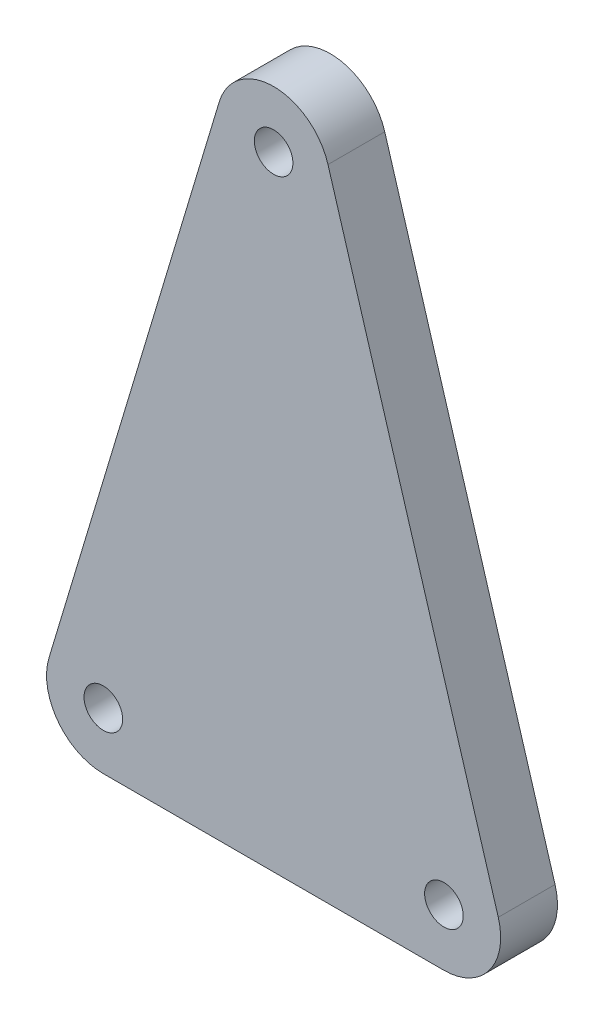
ISO-10303-21;
HEADER;
FILE_DESCRIPTION(('STEP AP214'),'2;1');
FILE_NAME('part.step','',(''),(''),'','','');
FILE_SCHEMA(('AUTOMOTIVE_DESIGN { 1 0 10303 214 1 1 1 1 }'));
ENDSEC;
DATA;
#1=APPLICATION_CONTEXT('core data for automotive mechanical design processes');
#2=APPLICATION_PROTOCOL_DEFINITION('international standard','automotive_design',2000,#1);
#3=PRODUCT_CONTEXT('',#1,'mechanical');
#4=PRODUCT('Part','Part','',(#3));
#5=PRODUCT_RELATED_PRODUCT_CATEGORY('part','',(#4));
#6=PRODUCT_DEFINITION_FORMATION('','',#4);
#7=PRODUCT_DEFINITION_CONTEXT('part definition',#1,'design');
#8=PRODUCT_DEFINITION('design','',#6,#7);
#9=PRODUCT_DEFINITION_SHAPE('','',#8);
#10=(LENGTH_UNIT() NAMED_UNIT(*) SI_UNIT(.MILLI.,.METRE.));
#11=(NAMED_UNIT(*) PLANE_ANGLE_UNIT() SI_UNIT($,.RADIAN.));
#12=(NAMED_UNIT(*) SI_UNIT($,.STERADIAN.) SOLID_ANGLE_UNIT());
#13=UNCERTAINTY_MEASURE_WITH_UNIT(LENGTH_MEASURE(1.E-05),#10,'distance_accuracy_value','');
#14=(GEOMETRIC_REPRESENTATION_CONTEXT(3) GLOBAL_UNCERTAINTY_ASSIGNED_CONTEXT((#13)) GLOBAL_UNIT_ASSIGNED_CONTEXT((#10,
#11,#12)) REPRESENTATION_CONTEXT('',''));
#15=CARTESIAN_POINT('',(0.,0.,0.));
#16=DIRECTION('',(0.,0.,1.));
#17=DIRECTION('',(1.,0.,0.));
#18=AXIS2_PLACEMENT_3D('',#15,#16,#17);
#19=CARTESIAN_POINT('',(0.,49.92,5.));
#20=DIRECTION('',(0.,0.,-1.));
#21=DIRECTION('',(-1.,0.,0.));
#22=AXIS2_PLACEMENT_3D('',#19,#20,#21);
#23=CYLINDRICAL_SURFACE('',#22,5.);
#24=CARTESIAN_POINT('',(0.,49.92,0.));
#25=DIRECTION('',(0.,0.,1.));
#26=DIRECTION('',(1.,0.,0.));
#27=AXIS2_PLACEMENT_3D('',#24,#25,#26);
#28=CIRCLE('',#27,5.);
#29=CARTESIAN_POINT('',(4.78849733775923,51.3588513635094,0.));
#30=VERTEX_POINT('',#29);
#31=CARTESIAN_POINT('',(-4.78849733775923,51.3588513635094,0.));
#32=VERTEX_POINT('',#31);
#33=EDGE_CURVE('E116',#30,#32,#28,.T.);
#34=ORIENTED_EDGE('',*,*,#33,.T.);
#35=DIRECTION('',(0.,0.,-1.));
#36=VECTOR('',#35,1.);
#37=CARTESIAN_POINT('',(-4.78849733775923,51.3588513635094,5.));
#38=LINE('',#37,#36);
#39=CARTESIAN_POINT('',(-4.78849733775923,51.3588513635094,5.));
#40=VERTEX_POINT('',#39);
#41=EDGE_CURVE('E11',#40,#32,#38,.T.);
#42=ORIENTED_EDGE('',*,*,#41,.F.);
#43=CARTESIAN_POINT('',(0.,49.92,5.));
#44=DIRECTION('',(0.,0.,1.));
#45=DIRECTION('',(1.,0.,0.));
#46=AXIS2_PLACEMENT_3D('',#43,#44,#45);
#47=CIRCLE('',#46,5.);
#48=CARTESIAN_POINT('',(4.78849733775923,51.3588513635094,5.));
#49=VERTEX_POINT('',#48);
#50=EDGE_CURVE('E127',#49,#40,#47,.T.);
#51=ORIENTED_EDGE('',*,*,#50,.F.);
#52=DIRECTION('',(0.,0.,-1.));
#53=VECTOR('',#52,1.);
#54=CARTESIAN_POINT('',(4.78849733775923,51.3588513635094,5.));
#55=LINE('',#54,#53);
#56=EDGE_CURVE('E112',#49,#30,#55,.T.);
#57=ORIENTED_EDGE('',*,*,#56,.T.);
#58=EDGE_LOOP('',(#34,#42,#51,#57));
#59=FACE_BOUND('',#58,.T.);
#60=ADVANCED_FACE('F32',(#59),#23,.T.);
#61=CARTESIAN_POINT('',(-4.78849733775923,51.3588513635094,5.));
#62=DIRECTION('',(0.957699467551845,-0.287770272701877,0.));
#63=DIRECTION('',(0.287770272701877,0.957699467551845,0.));
#64=AXIS2_PLACEMENT_3D('',#61,#62,#63);
#65=PLANE('',#64);
#66=DIRECTION('',(-0.287770272701877,-0.957699467551845,0.));
#67=VECTOR('',#66,1.);
#68=CARTESIAN_POINT('',(-4.78849733775923,51.3588513635094,0.));
#69=LINE('',#68,#67);
#70=CARTESIAN_POINT('',(-19.7884973377592,1.43885136350939,0.));
#71=VERTEX_POINT('',#70);
#72=EDGE_CURVE('E119',#32,#71,#69,.T.);
#73=ORIENTED_EDGE('',*,*,#72,.T.);
#74=DIRECTION('',(0.,0.,-1.));
#75=VECTOR('',#74,1.);
#76=CARTESIAN_POINT('',(-19.7884973377592,1.43885136350939,5.));
#77=LINE('',#76,#75);
#78=CARTESIAN_POINT('',(-19.7884973377592,1.43885136350939,5.));
#79=VERTEX_POINT('',#78);
#80=EDGE_CURVE('E40',#79,#71,#77,.T.);
#81=ORIENTED_EDGE('',*,*,#80,.F.);
#82=DIRECTION('',(-0.287770272701877,-0.957699467551845,0.));
#83=VECTOR('',#82,1.);
#84=CARTESIAN_POINT('',(-4.78849733775923,51.3588513635094,5.));
#85=LINE('',#84,#83);
#86=EDGE_CURVE('E85',#40,#79,#85,.T.);
#87=ORIENTED_EDGE('',*,*,#86,.F.);
#88=ORIENTED_EDGE('',*,*,#41,.T.);
#89=EDGE_LOOP('',(#73,#81,#87,#88));
#90=FACE_BOUND('',#89,.T.);
#91=ADVANCED_FACE('F152',(#90),#65,.F.);
#92=CARTESIAN_POINT('',(-15.,0.,5.));
#93=DIRECTION('',(0.,0.,-1.));
#94=DIRECTION('',(-1.,0.,0.));
#95=AXIS2_PLACEMENT_3D('',#92,#93,#94);
#96=CYLINDRICAL_SURFACE('',#95,5.);
#97=CARTESIAN_POINT('',(-15.,0.,0.));
#98=DIRECTION('',(0.,0.,1.));
#99=DIRECTION('',(-1.,0.,0.));
#100=AXIS2_PLACEMENT_3D('',#97,#98,#99);
#101=CIRCLE('',#100,5.);
#102=CARTESIAN_POINT('',(-15.,-5.,0.));
#103=VERTEX_POINT('',#102);
#104=EDGE_CURVE('E122',#71,#103,#101,.T.);
#105=ORIENTED_EDGE('',*,*,#104,.T.);
#106=DIRECTION('',(0.,0.,-1.));
#107=VECTOR('',#106,1.);
#108=CARTESIAN_POINT('',(-15.,-5.,5.));
#109=LINE('',#108,#107);
#110=CARTESIAN_POINT('',(-15.,-5.,5.));
#111=VERTEX_POINT('',#110);
#112=EDGE_CURVE('E107',#111,#103,#109,.T.);
#113=ORIENTED_EDGE('',*,*,#112,.F.);
#114=CARTESIAN_POINT('',(-15.,0.,5.));
#115=DIRECTION('',(0.,0.,1.));
#116=DIRECTION('',(-1.,0.,0.));
#117=AXIS2_PLACEMENT_3D('',#114,#115,#116);
#118=CIRCLE('',#117,5.);
#119=EDGE_CURVE('E98',#79,#111,#118,.T.);
#120=ORIENTED_EDGE('',*,*,#119,.F.);
#121=ORIENTED_EDGE('',*,*,#80,.T.);
#122=EDGE_LOOP('',(#105,#113,#120,#121));
#123=FACE_BOUND('',#122,.T.);
#124=ADVANCED_FACE('F133',(#123),#96,.T.);
#125=CARTESIAN_POINT('',(15.,-5.,5.));
#126=DIRECTION('',(0.,1.,0.));
#127=DIRECTION('',(0.,0.,1.));
#128=AXIS2_PLACEMENT_3D('',#125,#126,#127);
#129=PLANE('',#128);
#130=DIRECTION('',(1.,0.,0.));
#131=VECTOR('',#130,1.);
#132=CARTESIAN_POINT('',(15.,-5.,0.));
#133=LINE('',#132,#131);
#134=CARTESIAN_POINT('',(15.,-5.,0.));
#135=VERTEX_POINT('',#134);
#136=EDGE_CURVE('E106',#103,#135,#133,.T.);
#137=ORIENTED_EDGE('',*,*,#136,.T.);
#138=DIRECTION('',(0.,0.,-1.));
#139=VECTOR('',#138,1.);
#140=CARTESIAN_POINT('',(15.,-5.,5.));
#141=LINE('',#140,#139);
#142=CARTESIAN_POINT('',(15.,-5.,5.));
#143=VERTEX_POINT('',#142);
#144=EDGE_CURVE('E103',#143,#135,#141,.T.);
#145=ORIENTED_EDGE('',*,*,#144,.F.);
#146=DIRECTION('',(1.,0.,0.));
#147=VECTOR('',#146,1.);
#148=CARTESIAN_POINT('',(15.,-5.,5.));
#149=LINE('',#148,#147);
#150=EDGE_CURVE('E92',#111,#143,#149,.T.);
#151=ORIENTED_EDGE('',*,*,#150,.F.);
#152=ORIENTED_EDGE('',*,*,#112,.T.);
#153=EDGE_LOOP('',(#137,#145,#151,#152));
#154=FACE_BOUND('',#153,.T.);
#155=ADVANCED_FACE('F104',(#154),#129,.F.);
#156=CARTESIAN_POINT('',(15.,0.,5.));
#157=DIRECTION('',(0.,0.,-1.));
#158=DIRECTION('',(-1.,0.,0.));
#159=AXIS2_PLACEMENT_3D('',#156,#157,#158);
#160=CYLINDRICAL_SURFACE('',#159,5.);
#161=CARTESIAN_POINT('',(15.,0.,0.));
#162=DIRECTION('',(0.,0.,1.));
#163=DIRECTION('',(1.,0.,0.));
#164=AXIS2_PLACEMENT_3D('',#161,#162,#163);
#165=CIRCLE('',#164,5.);
#166=CARTESIAN_POINT('',(19.7884973377592,1.43885136350938,0.));
#167=VERTEX_POINT('',#166);
#168=EDGE_CURVE('E71',#135,#167,#165,.T.);
#169=ORIENTED_EDGE('',*,*,#168,.T.);
#170=DIRECTION('',(0.,0.,-1.));
#171=VECTOR('',#170,1.);
#172=CARTESIAN_POINT('',(19.7884973377592,1.43885136350938,5.));
#173=LINE('',#172,#171);
#174=CARTESIAN_POINT('',(19.7884973377592,1.43885136350938,5.));
#175=VERTEX_POINT('',#174);
#176=EDGE_CURVE('E108',#175,#167,#173,.T.);
#177=ORIENTED_EDGE('',*,*,#176,.F.);
#178=CARTESIAN_POINT('',(15.,0.,5.));
#179=DIRECTION('',(0.,0.,1.));
#180=DIRECTION('',(1.,0.,0.));
#181=AXIS2_PLACEMENT_3D('',#178,#179,#180);
#182=CIRCLE('',#181,5.);
#183=EDGE_CURVE('E96',#143,#175,#182,.T.);
#184=ORIENTED_EDGE('',*,*,#183,.F.);
#185=ORIENTED_EDGE('',*,*,#144,.T.);
#186=EDGE_LOOP('',(#169,#177,#184,#185));
#187=FACE_BOUND('',#186,.T.);
#188=ADVANCED_FACE('F110',(#187),#160,.T.);
#189=CARTESIAN_POINT('',(4.78849733775923,51.3588513635094,5.));
#190=DIRECTION('',(-0.957699467551845,-0.287770272701877,0.));
#191=DIRECTION('',(0.287770272701877,-0.957699467551845,0.));
#192=AXIS2_PLACEMENT_3D('',#189,#190,#191);
#193=PLANE('',#192);
#194=DIRECTION('',(-0.287770272701877,0.957699467551845,0.));
#195=VECTOR('',#194,1.);
#196=CARTESIAN_POINT('',(4.78849733775923,51.3588513635094,0.));
#197=LINE('',#196,#195);
#198=EDGE_CURVE('E77',#167,#30,#197,.T.);
#199=ORIENTED_EDGE('',*,*,#198,.T.);
#200=ORIENTED_EDGE('',*,*,#56,.F.);
#201=DIRECTION('',(-0.287770272701877,0.957699467551845,0.));
#202=VECTOR('',#201,1.);
#203=CARTESIAN_POINT('',(4.78849733775923,51.3588513635094,5.));
#204=LINE('',#203,#202);
#205=EDGE_CURVE('E48',#175,#49,#204,.T.);
#206=ORIENTED_EDGE('',*,*,#205,.F.);
#207=ORIENTED_EDGE('',*,*,#176,.T.);
#208=EDGE_LOOP('',(#199,#200,#206,#207));
#209=FACE_BOUND('',#208,.T.);
#210=ADVANCED_FACE('F140',(#209),#193,.F.);
#211=CARTESIAN_POINT('',(0.,49.92,5.));
#212=DIRECTION('',(0.,0.,1.));
#213=DIRECTION('',(1.,0.,0.));
#214=AXIS2_PLACEMENT_3D('',#211,#212,#213);
#215=PLANE('',#214);
#216=CARTESIAN_POINT('',(0.,49.92,5.));
#217=DIRECTION('',(0.,0.,-1.));
#218=DIRECTION('',(-1.,0.,0.));
#219=AXIS2_PLACEMENT_3D('',#216,#217,#218);
#220=CIRCLE('',#219,1.7);
#221=CARTESIAN_POINT('',(-1.7,49.92,5.));
#222=VERTEX_POINT('',#221);
#223=EDGE_CURVE('E260',#222,#222,#220,.T.);
#224=ORIENTED_EDGE('',*,*,#223,.T.);
#225=EDGE_LOOP('',(#224));
#226=FACE_BOUND('',#225,.T.);
#227=CARTESIAN_POINT('',(15.,0.,5.));
#228=DIRECTION('',(0.,0.,-1.));
#229=DIRECTION('',(-1.,0.,0.));
#230=AXIS2_PLACEMENT_3D('',#227,#228,#229);
#231=CIRCLE('',#230,1.7);
#232=CARTESIAN_POINT('',(13.3,0.,5.));
#233=VERTEX_POINT('',#232);
#234=EDGE_CURVE('E271',#233,#233,#231,.T.);
#235=ORIENTED_EDGE('',*,*,#234,.T.);
#236=EDGE_LOOP('',(#235));
#237=FACE_BOUND('',#236,.T.);
#238=CARTESIAN_POINT('',(-15.,0.,5.));
#239=DIRECTION('',(0.,0.,-1.));
#240=DIRECTION('',(-1.,0.,0.));
#241=AXIS2_PLACEMENT_3D('',#238,#239,#240);
#242=CIRCLE('',#241,1.7);
#243=CARTESIAN_POINT('',(-16.7,0.,5.));
#244=VERTEX_POINT('',#243);
#245=EDGE_CURVE('E120',#244,#244,#242,.T.);
#246=ORIENTED_EDGE('',*,*,#245,.T.);
#247=EDGE_LOOP('',(#246));
#248=FACE_BOUND('',#247,.T.);
#249=ORIENTED_EDGE('',*,*,#50,.T.);
#250=ORIENTED_EDGE('',*,*,#86,.T.);
#251=ORIENTED_EDGE('',*,*,#119,.T.);
#252=ORIENTED_EDGE('',*,*,#150,.T.);
#253=ORIENTED_EDGE('',*,*,#183,.T.);
#254=ORIENTED_EDGE('',*,*,#205,.T.);
#255=EDGE_LOOP('',(#249,#250,#251,#252,#253,#254));
#256=FACE_BOUND('',#255,.T.);
#257=ADVANCED_FACE('F94',(#226,#237,#248,#256),#215,.T.);
#258=CARTESIAN_POINT('',(0.,49.92,0.));
#259=DIRECTION('',(0.,0.,1.));
#260=DIRECTION('',(1.,0.,0.));
#261=AXIS2_PLACEMENT_3D('',#258,#259,#260);
#262=PLANE('',#261);
#263=CARTESIAN_POINT('',(0.,49.92,0.));
#264=DIRECTION('',(0.,0.,-1.));
#265=DIRECTION('',(-1.,0.,0.));
#266=AXIS2_PLACEMENT_3D('',#263,#264,#265);
#267=CIRCLE('',#266,3.15);
#268=CARTESIAN_POINT('',(-3.15,49.92,0.));
#269=VERTEX_POINT('',#268);
#270=EDGE_CURVE('E258',#269,#269,#267,.T.);
#271=ORIENTED_EDGE('',*,*,#270,.F.);
#272=EDGE_LOOP('',(#271));
#273=FACE_BOUND('',#272,.T.);
#274=CARTESIAN_POINT('',(15.,0.,0.));
#275=DIRECTION('',(0.,0.,-1.));
#276=DIRECTION('',(-1.,0.,0.));
#277=AXIS2_PLACEMENT_3D('',#274,#275,#276);
#278=CIRCLE('',#277,3.15);
#279=CARTESIAN_POINT('',(11.85,0.,0.));
#280=VERTEX_POINT('',#279);
#281=EDGE_CURVE('E265',#280,#280,#278,.T.);
#282=ORIENTED_EDGE('',*,*,#281,.F.);
#283=EDGE_LOOP('',(#282));
#284=FACE_BOUND('',#283,.T.);
#285=CARTESIAN_POINT('',(-15.,0.,0.));
#286=DIRECTION('',(0.,0.,-1.));
#287=DIRECTION('',(-1.,0.,0.));
#288=AXIS2_PLACEMENT_3D('',#285,#286,#287);
#289=CIRCLE('',#288,3.15);
#290=CARTESIAN_POINT('',(-18.15,0.,0.));
#291=VERTEX_POINT('',#290);
#292=EDGE_CURVE('E274',#291,#291,#289,.T.);
#293=ORIENTED_EDGE('',*,*,#292,.F.);
#294=EDGE_LOOP('',(#293));
#295=FACE_BOUND('',#294,.T.);
#296=ORIENTED_EDGE('',*,*,#33,.F.);
#297=ORIENTED_EDGE('',*,*,#198,.F.);
#298=ORIENTED_EDGE('',*,*,#168,.F.);
#299=ORIENTED_EDGE('',*,*,#136,.F.);
#300=ORIENTED_EDGE('',*,*,#104,.F.);
#301=ORIENTED_EDGE('',*,*,#72,.F.);
#302=EDGE_LOOP('',(#296,#297,#298,#299,#300,#301));
#303=FACE_BOUND('',#302,.T.);
#304=ADVANCED_FACE('F136',(#273,#284,#295,#303),#262,.F.);
#305=CARTESIAN_POINT('',(-15.,0.,0.));
#306=DIRECTION('',(0.,0.,-1.));
#307=DIRECTION('',(-1.,0.,0.));
#308=AXIS2_PLACEMENT_3D('',#305,#306,#307);
#309=CYLINDRICAL_SURFACE('',#308,1.69999999999999);
#310=ORIENTED_EDGE('',*,*,#245,.F.);
#311=EDGE_LOOP('',(#310));
#312=FACE_BOUND('',#311,.T.);
#313=CARTESIAN_POINT('',(-15.,0.,1.45000000000001));
#314=DIRECTION('',(0.,0.,-1.));
#315=DIRECTION('',(-1.,0.,0.));
#316=AXIS2_PLACEMENT_3D('',#313,#314,#315);
#317=CIRCLE('',#316,1.69999999999999);
#318=CARTESIAN_POINT('',(-16.7,0.,1.45000000000001));
#319=VERTEX_POINT('',#318);
#320=EDGE_CURVE('E277',#319,#319,#317,.T.);
#321=ORIENTED_EDGE('',*,*,#320,.T.);
#322=EDGE_LOOP('',(#321));
#323=FACE_BOUND('',#322,.T.);
#324=ADVANCED_FACE('F189',(#312,#323),#309,.F.);
#325=CARTESIAN_POINT('',(-15.,0.,0.));
#326=DIRECTION('',(0.,0.,-1.));
#327=DIRECTION('',(-1.,0.,0.));
#328=AXIS2_PLACEMENT_3D('',#325,#326,#327);
#329=CONICAL_SURFACE('',#328,3.15,0.78539816339745);
#330=ORIENTED_EDGE('',*,*,#320,.F.);
#331=EDGE_LOOP('',(#330));
#332=FACE_BOUND('',#331,.T.);
#333=ORIENTED_EDGE('',*,*,#292,.T.);
#334=EDGE_LOOP('',(#333));
#335=FACE_BOUND('',#334,.T.);
#336=ADVANCED_FACE('F198',(#332,#335),#329,.F.);
#337=CARTESIAN_POINT('',(15.,0.,0.));
#338=DIRECTION('',(0.,0.,-1.));
#339=DIRECTION('',(-1.,0.,0.));
#340=AXIS2_PLACEMENT_3D('',#337,#338,#339);
#341=CYLINDRICAL_SURFACE('',#340,1.69999999999999);
#342=ORIENTED_EDGE('',*,*,#234,.F.);
#343=EDGE_LOOP('',(#342));
#344=FACE_BOUND('',#343,.T.);
#345=CARTESIAN_POINT('',(15.,0.,1.45000000000001));
#346=DIRECTION('',(0.,0.,-1.));
#347=DIRECTION('',(-1.,0.,0.));
#348=AXIS2_PLACEMENT_3D('',#345,#346,#347);
#349=CIRCLE('',#348,1.69999999999999);
#350=CARTESIAN_POINT('',(13.3,0.,1.45000000000001));
#351=VERTEX_POINT('',#350);
#352=EDGE_CURVE('E268',#351,#351,#349,.T.);
#353=ORIENTED_EDGE('',*,*,#352,.T.);
#354=EDGE_LOOP('',(#353));
#355=FACE_BOUND('',#354,.T.);
#356=ADVANCED_FACE('F208',(#344,#355),#341,.F.);
#357=CARTESIAN_POINT('',(15.,0.,0.));
#358=DIRECTION('',(0.,0.,-1.));
#359=DIRECTION('',(-1.,0.,0.));
#360=AXIS2_PLACEMENT_3D('',#357,#358,#359);
#361=CONICAL_SURFACE('',#360,3.15,0.78539816339745);
#362=ORIENTED_EDGE('',*,*,#352,.F.);
#363=EDGE_LOOP('',(#362));
#364=FACE_BOUND('',#363,.T.);
#365=ORIENTED_EDGE('',*,*,#281,.T.);
#366=EDGE_LOOP('',(#365));
#367=FACE_BOUND('',#366,.T.);
#368=ADVANCED_FACE('F218',(#364,#367),#361,.F.);
#369=CARTESIAN_POINT('',(0.,49.92,0.));
#370=DIRECTION('',(0.,0.,-1.));
#371=DIRECTION('',(-1.,0.,0.));
#372=AXIS2_PLACEMENT_3D('',#369,#370,#371);
#373=CYLINDRICAL_SURFACE('',#372,1.69999999999999);
#374=ORIENTED_EDGE('',*,*,#223,.F.);
#375=EDGE_LOOP('',(#374));
#376=FACE_BOUND('',#375,.T.);
#377=CARTESIAN_POINT('',(0.,49.92,1.45000000000001));
#378=DIRECTION('',(0.,0.,-1.));
#379=DIRECTION('',(-1.,0.,0.));
#380=AXIS2_PLACEMENT_3D('',#377,#378,#379);
#381=CIRCLE('',#380,1.69999999999999);
#382=CARTESIAN_POINT('',(-1.69999999999999,49.92,1.45000000000001));
#383=VERTEX_POINT('',#382);
#384=EDGE_CURVE('E255',#383,#383,#381,.T.);
#385=ORIENTED_EDGE('',*,*,#384,.T.);
#386=EDGE_LOOP('',(#385));
#387=FACE_BOUND('',#386,.T.);
#388=ADVANCED_FACE('F228',(#376,#387),#373,.F.);
#389=CARTESIAN_POINT('',(0.,49.92,0.));
#390=DIRECTION('',(0.,0.,-1.));
#391=DIRECTION('',(-1.,0.,0.));
#392=AXIS2_PLACEMENT_3D('',#389,#390,#391);
#393=CONICAL_SURFACE('',#392,3.15,0.78539816339745);
#394=ORIENTED_EDGE('',*,*,#384,.F.);
#395=EDGE_LOOP('',(#394));
#396=FACE_BOUND('',#395,.T.);
#397=ORIENTED_EDGE('',*,*,#270,.T.);
#398=EDGE_LOOP('',(#397));
#399=FACE_BOUND('',#398,.T.);
#400=ADVANCED_FACE('F238',(#396,#399),#393,.F.);
#401=CLOSED_SHELL('',(#60,#91,#124,#155,#188,#210,#257,#304,#324,#336,#356,#368,#388,#400));
#402=MANIFOLD_SOLID_BREP('B2',#401);
#403=ADVANCED_BREP_SHAPE_REPRESENTATION('',(#18,#402),#14);
#404=SHAPE_DEFINITION_REPRESENTATION(#9,#403);
ENDSEC;
END-ISO-10303-21;
